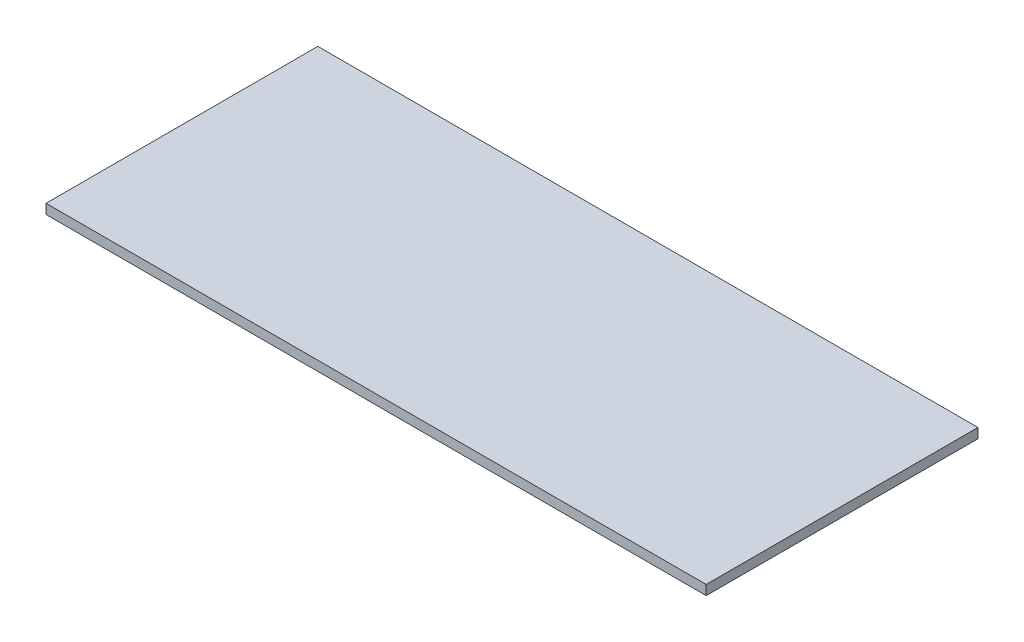
ISO-10303-21;
HEADER;
FILE_DESCRIPTION(('STEP AP214'),'2;1');
FILE_NAME('part.step','',(''),(''),'','','');
FILE_SCHEMA(('AUTOMOTIVE_DESIGN { 1 0 10303 214 1 1 1 1 }'));
ENDSEC;
DATA;
#1=APPLICATION_CONTEXT('core data for automotive mechanical design processes');
#2=APPLICATION_PROTOCOL_DEFINITION('international standard','automotive_design',2000,#1);
#3=PRODUCT_CONTEXT('',#1,'mechanical');
#4=PRODUCT('Part','Part','',(#3));
#5=PRODUCT_RELATED_PRODUCT_CATEGORY('part','',(#4));
#6=PRODUCT_DEFINITION_FORMATION('','',#4);
#7=PRODUCT_DEFINITION_CONTEXT('part definition',#1,'design');
#8=PRODUCT_DEFINITION('design','',#6,#7);
#9=PRODUCT_DEFINITION_SHAPE('','',#8);
#10=(LENGTH_UNIT() NAMED_UNIT(*) SI_UNIT(.MILLI.,.METRE.));
#11=(NAMED_UNIT(*) PLANE_ANGLE_UNIT() SI_UNIT($,.RADIAN.));
#12=(NAMED_UNIT(*) SI_UNIT($,.STERADIAN.) SOLID_ANGLE_UNIT());
#13=UNCERTAINTY_MEASURE_WITH_UNIT(LENGTH_MEASURE(1.E-05),#10,'distance_accuracy_value','');
#14=(GEOMETRIC_REPRESENTATION_CONTEXT(3) GLOBAL_UNCERTAINTY_ASSIGNED_CONTEXT((#13)) GLOBAL_UNIT_ASSIGNED_CONTEXT((#10,
#11,#12)) REPRESENTATION_CONTEXT('',''));
#15=CARTESIAN_POINT('',(0.,0.,0.));
#16=DIRECTION('',(0.,0.,1.));
#17=DIRECTION('',(1.,0.,0.));
#18=AXIS2_PLACEMENT_3D('',#15,#16,#17);
#19=CARTESIAN_POINT('',(340.,10.,140.));
#20=DIRECTION('',(-1.,0.,0.));
#21=DIRECTION('',(0.,0.,1.));
#22=AXIS2_PLACEMENT_3D('',#19,#20,#21);
#23=PLANE('',#22);
#24=DIRECTION('',(0.,0.,-1.));
#25=VECTOR('',#24,1.);
#26=CARTESIAN_POINT('',(340.,0.,140.));
#27=LINE('',#26,#25);
#28=CARTESIAN_POINT('',(340.,0.,140.));
#29=VERTEX_POINT('',#28);
#30=CARTESIAN_POINT('',(340.,0.,-140.));
#31=VERTEX_POINT('',#30);
#32=EDGE_CURVE('E96',#29,#31,#27,.T.);
#33=ORIENTED_EDGE('',*,*,#32,.T.);
#34=DIRECTION('',(0.,-1.,0.));
#35=VECTOR('',#34,1.);
#36=CARTESIAN_POINT('',(340.,10.,-140.));
#37=LINE('',#36,#35);
#38=CARTESIAN_POINT('',(340.,10.,-140.));
#39=VERTEX_POINT('',#38);
#40=EDGE_CURVE('E11',#39,#31,#37,.T.);
#41=ORIENTED_EDGE('',*,*,#40,.F.);
#42=DIRECTION('',(0.,0.,-1.));
#43=VECTOR('',#42,1.);
#44=CARTESIAN_POINT('',(340.,10.,140.));
#45=LINE('',#44,#43);
#46=CARTESIAN_POINT('',(340.,10.,140.));
#47=VERTEX_POINT('',#46);
#48=EDGE_CURVE('E84',#47,#39,#45,.T.);
#49=ORIENTED_EDGE('',*,*,#48,.F.);
#50=DIRECTION('',(0.,-1.,0.));
#51=VECTOR('',#50,1.);
#52=CARTESIAN_POINT('',(340.,10.,140.));
#53=LINE('',#52,#51);
#54=EDGE_CURVE('E92',#47,#29,#53,.T.);
#55=ORIENTED_EDGE('',*,*,#54,.T.);
#56=EDGE_LOOP('',(#33,#41,#49,#55));
#57=FACE_BOUND('',#56,.T.);
#58=ADVANCED_FACE('F33',(#57),#23,.F.);
#59=CARTESIAN_POINT('',(-340.,10.,-140.));
#60=DIRECTION('',(0.,0.,1.));
#61=DIRECTION('',(1.,0.,0.));
#62=AXIS2_PLACEMENT_3D('',#59,#60,#61);
#63=PLANE('',#62);
#64=DIRECTION('',(-1.,0.,0.));
#65=VECTOR('',#64,1.);
#66=CARTESIAN_POINT('',(-340.,0.,-140.));
#67=LINE('',#66,#65);
#68=CARTESIAN_POINT('',(-340.,0.,-140.));
#69=VERTEX_POINT('',#68);
#70=EDGE_CURVE('E88',#31,#69,#67,.T.);
#71=ORIENTED_EDGE('',*,*,#70,.T.);
#72=DIRECTION('',(0.,-1.,0.));
#73=VECTOR('',#72,1.);
#74=CARTESIAN_POINT('',(-340.,10.,-140.));
#75=LINE('',#74,#73);
#76=CARTESIAN_POINT('',(-340.,10.,-140.));
#77=VERTEX_POINT('',#76);
#78=EDGE_CURVE('E41',#77,#69,#75,.T.);
#79=ORIENTED_EDGE('',*,*,#78,.F.);
#80=DIRECTION('',(-1.,0.,0.));
#81=VECTOR('',#80,1.);
#82=CARTESIAN_POINT('',(-340.,10.,-140.));
#83=LINE('',#82,#81);
#84=EDGE_CURVE('E79',#39,#77,#83,.T.);
#85=ORIENTED_EDGE('',*,*,#84,.F.);
#86=ORIENTED_EDGE('',*,*,#40,.T.);
#87=EDGE_LOOP('',(#71,#79,#85,#86));
#88=FACE_BOUND('',#87,.T.);
#89=ADVANCED_FACE('F87',(#88),#63,.F.);
#90=CARTESIAN_POINT('',(-340.,10.,140.));
#91=DIRECTION('',(1.,0.,0.));
#92=DIRECTION('',(0.,0.,-1.));
#93=AXIS2_PLACEMENT_3D('',#90,#91,#92);
#94=PLANE('',#93);
#95=DIRECTION('',(0.,0.,1.));
#96=VECTOR('',#95,1.);
#97=CARTESIAN_POINT('',(-340.,0.,140.));
#98=LINE('',#97,#96);
#99=CARTESIAN_POINT('',(-340.,0.,140.));
#100=VERTEX_POINT('',#99);
#101=EDGE_CURVE('E66',#69,#100,#98,.T.);
#102=ORIENTED_EDGE('',*,*,#101,.T.);
#103=DIRECTION('',(0.,-1.,0.));
#104=VECTOR('',#103,1.);
#105=CARTESIAN_POINT('',(-340.,10.,140.));
#106=LINE('',#105,#104);
#107=CARTESIAN_POINT('',(-340.,10.,140.));
#108=VERTEX_POINT('',#107);
#109=EDGE_CURVE('E89',#108,#100,#106,.T.);
#110=ORIENTED_EDGE('',*,*,#109,.F.);
#111=DIRECTION('',(0.,0.,1.));
#112=VECTOR('',#111,1.);
#113=CARTESIAN_POINT('',(-340.,10.,140.));
#114=LINE('',#113,#112);
#115=EDGE_CURVE('E82',#77,#108,#114,.T.);
#116=ORIENTED_EDGE('',*,*,#115,.F.);
#117=ORIENTED_EDGE('',*,*,#78,.T.);
#118=EDGE_LOOP('',(#102,#110,#116,#117));
#119=FACE_BOUND('',#118,.T.);
#120=ADVANCED_FACE('F90',(#119),#94,.F.);
#121=CARTESIAN_POINT('',(-340.,10.,140.));
#122=DIRECTION('',(0.,0.,-1.));
#123=DIRECTION('',(-1.,0.,0.));
#124=AXIS2_PLACEMENT_3D('',#121,#122,#123);
#125=PLANE('',#124);
#126=DIRECTION('',(1.,0.,0.));
#127=VECTOR('',#126,1.);
#128=CARTESIAN_POINT('',(-340.,0.,140.));
#129=LINE('',#128,#127);
#130=EDGE_CURVE('E72',#100,#29,#129,.T.);
#131=ORIENTED_EDGE('',*,*,#130,.T.);
#132=ORIENTED_EDGE('',*,*,#54,.F.);
#133=DIRECTION('',(1.,0.,0.));
#134=VECTOR('',#133,1.);
#135=CARTESIAN_POINT('',(-340.,10.,140.));
#136=LINE('',#135,#134);
#137=EDGE_CURVE('E49',#108,#47,#136,.T.);
#138=ORIENTED_EDGE('',*,*,#137,.F.);
#139=ORIENTED_EDGE('',*,*,#109,.T.);
#140=EDGE_LOOP('',(#131,#132,#138,#139));
#141=FACE_BOUND('',#140,.T.);
#142=ADVANCED_FACE('F103',(#141),#125,.F.);
#143=CARTESIAN_POINT('',(0.,10.,0.));
#144=DIRECTION('',(0.,-1.,0.));
#145=DIRECTION('',(0.,0.,-1.));
#146=AXIS2_PLACEMENT_3D('',#143,#144,#145);
#147=PLANE('',#146);
#148=ORIENTED_EDGE('',*,*,#48,.T.);
#149=ORIENTED_EDGE('',*,*,#84,.T.);
#150=ORIENTED_EDGE('',*,*,#115,.T.);
#151=ORIENTED_EDGE('',*,*,#137,.T.);
#152=EDGE_LOOP('',(#148,#149,#150,#151));
#153=FACE_BOUND('',#152,.T.);
#154=ADVANCED_FACE('F80',(#153),#147,.F.);
#155=CARTESIAN_POINT('',(0.,0.,0.));
#156=DIRECTION('',(0.,-1.,0.));
#157=DIRECTION('',(0.,0.,-1.));
#158=AXIS2_PLACEMENT_3D('',#155,#156,#157);
#159=PLANE('',#158);
#160=ORIENTED_EDGE('',*,*,#32,.F.);
#161=ORIENTED_EDGE('',*,*,#130,.F.);
#162=ORIENTED_EDGE('',*,*,#101,.F.);
#163=ORIENTED_EDGE('',*,*,#70,.F.);
#164=EDGE_LOOP('',(#160,#161,#162,#163));
#165=FACE_BOUND('',#164,.T.);
#166=ADVANCED_FACE('F106',(#165),#159,.T.);
#167=CLOSED_SHELL('',(#58,#89,#120,#142,#154,#166));
#168=MANIFOLD_SOLID_BREP('B2',#167);
#169=ADVANCED_BREP_SHAPE_REPRESENTATION('',(#18,#168),#14);
#170=SHAPE_DEFINITION_REPRESENTATION(#9,#169);
ENDSEC;
END-ISO-10303-21;
